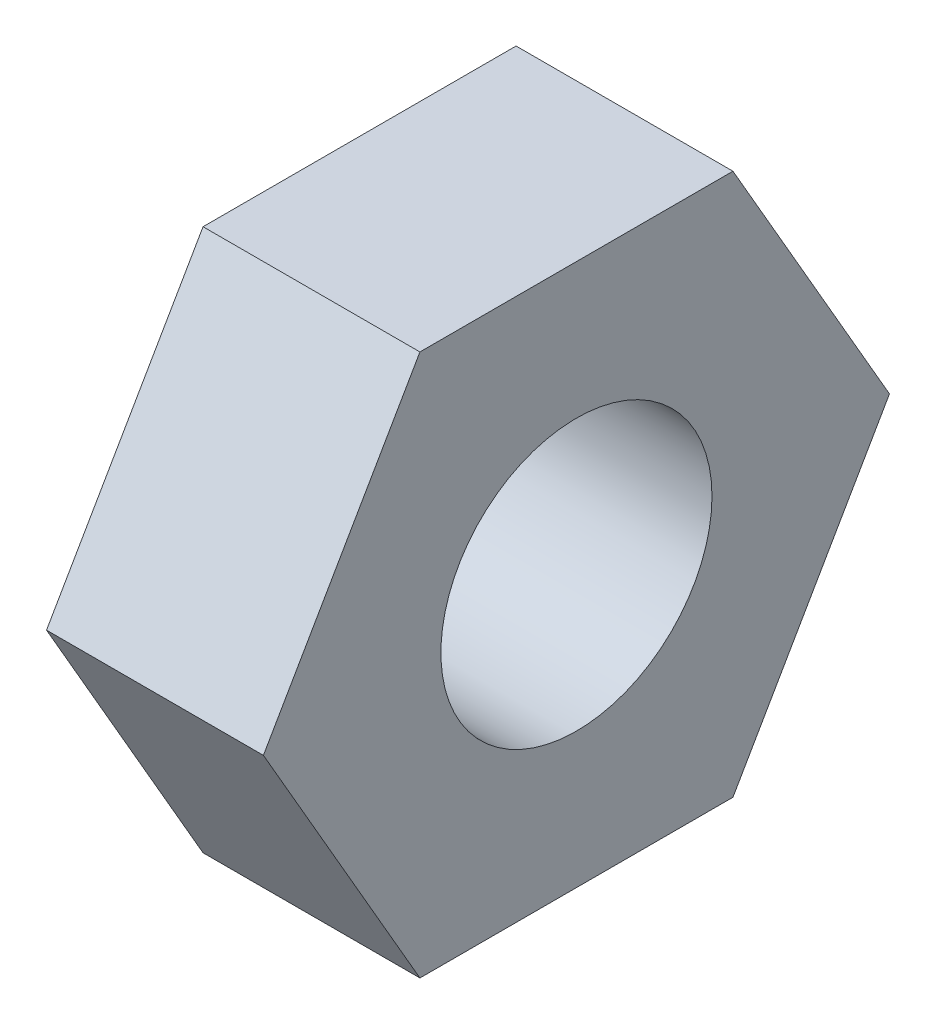
ISO-10303-21;
HEADER;
FILE_DESCRIPTION(('STEP AP214'),'2;1');
FILE_NAME('part.step','',(''),(''),'','','');
FILE_SCHEMA(('AUTOMOTIVE_DESIGN { 1 0 10303 214 1 1 1 1 }'));
ENDSEC;
DATA;
#1=APPLICATION_CONTEXT('core data for automotive mechanical design processes');
#2=APPLICATION_PROTOCOL_DEFINITION('international standard','automotive_design',2000,#1);
#3=PRODUCT_CONTEXT('',#1,'mechanical');
#4=PRODUCT('Part','Part','',(#3));
#5=PRODUCT_RELATED_PRODUCT_CATEGORY('part','',(#4));
#6=PRODUCT_DEFINITION_FORMATION('','',#4);
#7=PRODUCT_DEFINITION_CONTEXT('part definition',#1,'design');
#8=PRODUCT_DEFINITION('design','',#6,#7);
#9=PRODUCT_DEFINITION_SHAPE('','',#8);
#10=(LENGTH_UNIT() NAMED_UNIT(*) SI_UNIT(.MILLI.,.METRE.));
#11=(NAMED_UNIT(*) PLANE_ANGLE_UNIT() SI_UNIT($,.RADIAN.));
#12=(NAMED_UNIT(*) SI_UNIT($,.STERADIAN.) SOLID_ANGLE_UNIT());
#13=UNCERTAINTY_MEASURE_WITH_UNIT(LENGTH_MEASURE(1.E-05),#10,'distance_accuracy_value','');
#14=(GEOMETRIC_REPRESENTATION_CONTEXT(3) GLOBAL_UNCERTAINTY_ASSIGNED_CONTEXT((#13)) GLOBAL_UNIT_ASSIGNED_CONTEXT((#10,
#11,#12)) REPRESENTATION_CONTEXT('',''));
#15=CARTESIAN_POINT('',(0.,0.,0.));
#16=DIRECTION('',(0.,0.,1.));
#17=DIRECTION('',(1.,0.,0.));
#18=AXIS2_PLACEMENT_3D('',#15,#16,#17);
#19=CARTESIAN_POINT('',(2.,-2.5,-1.44337567297406));
#20=DIRECTION('',(0.,0.5,0.866025403784439));
#21=DIRECTION('',(0.,-0.866025403784439,0.5));
#22=AXIS2_PLACEMENT_3D('',#19,#20,#21);
#23=PLANE('',#22);
#24=DIRECTION('',(0.,0.866025403784439,-0.5));
#25=VECTOR('',#24,1.);
#26=CARTESIAN_POINT('',(0.,-2.5,-1.44337567297406));
#27=LINE('',#26,#25);
#28=CARTESIAN_POINT('',(0.,-2.5,-1.44337567297406));
#29=VERTEX_POINT('',#28);
#30=CARTESIAN_POINT('',(0.,0.,-2.88675134594813));
#31=VERTEX_POINT('',#30);
#32=EDGE_CURVE('E127',#29,#31,#27,.T.);
#33=ORIENTED_EDGE('',*,*,#32,.T.);
#34=DIRECTION('',(-1.,0.,0.));
#35=VECTOR('',#34,1.);
#36=CARTESIAN_POINT('',(2.,0.,-2.88675134594813));
#37=LINE('',#36,#35);
#38=CARTESIAN_POINT('',(2.,0.,-2.88675134594813));
#39=VERTEX_POINT('',#38);
#40=EDGE_CURVE('E11',#39,#31,#37,.T.);
#41=ORIENTED_EDGE('',*,*,#40,.F.);
#42=DIRECTION('',(0.,0.866025403784439,-0.5));
#43=VECTOR('',#42,1.);
#44=CARTESIAN_POINT('',(2.,-2.5,-1.44337567297406));
#45=LINE('',#44,#43);
#46=CARTESIAN_POINT('',(2.,-2.5,-1.44337567297406));
#47=VERTEX_POINT('',#46);
#48=EDGE_CURVE('E139',#47,#39,#45,.T.);
#49=ORIENTED_EDGE('',*,*,#48,.F.);
#50=DIRECTION('',(-1.,0.,0.));
#51=VECTOR('',#50,1.);
#52=CARTESIAN_POINT('',(2.,-2.5,-1.44337567297406));
#53=LINE('',#52,#51);
#54=EDGE_CURVE('E124',#47,#29,#53,.T.);
#55=ORIENTED_EDGE('',*,*,#54,.T.);
#56=EDGE_LOOP('',(#33,#41,#49,#55));
#57=FACE_BOUND('',#56,.T.);
#58=ADVANCED_FACE('F41',(#57),#23,.F.);
#59=CARTESIAN_POINT('',(2.,0.,-2.88675134594813));
#60=DIRECTION('',(0.,-0.5,0.866025403784439));
#61=DIRECTION('',(0.,-0.866025403784439,-0.5));
#62=AXIS2_PLACEMENT_3D('',#59,#60,#61);
#63=PLANE('',#62);
#64=DIRECTION('',(0.,0.866025403784439,0.5));
#65=VECTOR('',#64,1.);
#66=CARTESIAN_POINT('',(0.,0.,-2.88675134594813));
#67=LINE('',#66,#65);
#68=CARTESIAN_POINT('',(0.,2.5,-1.44337567297406));
#69=VERTEX_POINT('',#68);
#70=EDGE_CURVE('E129',#31,#69,#67,.T.);
#71=ORIENTED_EDGE('',*,*,#70,.T.);
#72=DIRECTION('',(-1.,0.,0.));
#73=VECTOR('',#72,1.);
#74=CARTESIAN_POINT('',(2.,2.5,-1.44337567297406));
#75=LINE('',#74,#73);
#76=CARTESIAN_POINT('',(2.,2.5,-1.44337567297406));
#77=VERTEX_POINT('',#76);
#78=EDGE_CURVE('E49',#77,#69,#75,.T.);
#79=ORIENTED_EDGE('',*,*,#78,.F.);
#80=DIRECTION('',(0.,0.866025403784439,0.5));
#81=VECTOR('',#80,1.);
#82=CARTESIAN_POINT('',(2.,0.,-2.88675134594813));
#83=LINE('',#82,#81);
#84=EDGE_CURVE('E92',#39,#77,#83,.T.);
#85=ORIENTED_EDGE('',*,*,#84,.F.);
#86=ORIENTED_EDGE('',*,*,#40,.T.);
#87=EDGE_LOOP('',(#71,#79,#85,#86));
#88=FACE_BOUND('',#87,.T.);
#89=ADVANCED_FACE('F162',(#88),#63,.F.);
#90=CARTESIAN_POINT('',(2.,2.5,-1.44337567297406));
#91=DIRECTION('',(0.,-1.,0.));
#92=DIRECTION('',(0.,0.,-1.));
#93=AXIS2_PLACEMENT_3D('',#90,#91,#92);
#94=PLANE('',#93);
#95=DIRECTION('',(0.,0.,1.));
#96=VECTOR('',#95,1.);
#97=CARTESIAN_POINT('',(0.,2.5,-1.44337567297406));
#98=LINE('',#97,#96);
#99=CARTESIAN_POINT('',(0.,2.5,1.44337567297406));
#100=VERTEX_POINT('',#99);
#101=EDGE_CURVE('E131',#69,#100,#98,.T.);
#102=ORIENTED_EDGE('',*,*,#101,.T.);
#103=DIRECTION('',(-1.,0.,0.));
#104=VECTOR('',#103,1.);
#105=CARTESIAN_POINT('',(2.,2.5,1.44337567297406));
#106=LINE('',#105,#104);
#107=CARTESIAN_POINT('',(2.,2.5,1.44337567297406));
#108=VERTEX_POINT('',#107);
#109=EDGE_CURVE('E116',#108,#100,#106,.T.);
#110=ORIENTED_EDGE('',*,*,#109,.F.);
#111=DIRECTION('',(0.,0.,1.));
#112=VECTOR('',#111,1.);
#113=CARTESIAN_POINT('',(2.,2.5,-1.44337567297406));
#114=LINE('',#113,#112);
#115=EDGE_CURVE('E107',#77,#108,#114,.T.);
#116=ORIENTED_EDGE('',*,*,#115,.F.);
#117=ORIENTED_EDGE('',*,*,#78,.T.);
#118=EDGE_LOOP('',(#102,#110,#116,#117));
#119=FACE_BOUND('',#118,.T.);
#120=ADVANCED_FACE('F145',(#119),#94,.F.);
#121=CARTESIAN_POINT('',(2.,2.5,1.44337567297406));
#122=DIRECTION('',(0.,-0.5,-0.866025403784439));
#123=DIRECTION('',(0.,0.866025403784439,-0.5));
#124=AXIS2_PLACEMENT_3D('',#121,#122,#123);
#125=PLANE('',#124);
#126=DIRECTION('',(0.,-0.866025403784439,0.5));
#127=VECTOR('',#126,1.);
#128=CARTESIAN_POINT('',(0.,2.5,1.44337567297406));
#129=LINE('',#128,#127);
#130=CARTESIAN_POINT('',(0.,0.,2.88675134594813));
#131=VERTEX_POINT('',#130);
#132=EDGE_CURVE('E119',#100,#131,#129,.T.);
#133=ORIENTED_EDGE('',*,*,#132,.T.);
#134=DIRECTION('',(-1.,0.,0.));
#135=VECTOR('',#134,1.);
#136=CARTESIAN_POINT('',(2.,0.,2.88675134594813));
#137=LINE('',#136,#135);
#138=CARTESIAN_POINT('',(2.,0.,2.88675134594813));
#139=VERTEX_POINT('',#138);
#140=EDGE_CURVE('E114',#139,#131,#137,.T.);
#141=ORIENTED_EDGE('',*,*,#140,.F.);
#142=DIRECTION('',(0.,-0.866025403784439,0.5));
#143=VECTOR('',#142,1.);
#144=CARTESIAN_POINT('',(2.,2.5,1.44337567297406));
#145=LINE('',#144,#143);
#146=EDGE_CURVE('E105',#108,#139,#145,.T.);
#147=ORIENTED_EDGE('',*,*,#146,.F.);
#148=ORIENTED_EDGE('',*,*,#109,.T.);
#149=EDGE_LOOP('',(#133,#141,#147,#148));
#150=FACE_BOUND('',#149,.T.);
#151=ADVANCED_FACE('F111',(#150),#125,.F.);
#152=CARTESIAN_POINT('',(2.,0.,2.88675134594813));
#153=DIRECTION('',(0.,0.5,-0.866025403784439));
#154=DIRECTION('',(0.,0.866025403784439,0.5));
#155=AXIS2_PLACEMENT_3D('',#152,#153,#154);
#156=PLANE('',#155);
#157=DIRECTION('',(0.,-0.866025403784439,-0.5));
#158=VECTOR('',#157,1.);
#159=CARTESIAN_POINT('',(0.,0.,2.88675134594813));
#160=LINE('',#159,#158);
#161=CARTESIAN_POINT('',(0.,-2.5,1.44337567297407));
#162=VERTEX_POINT('',#161);
#163=EDGE_CURVE('E83',#131,#162,#160,.T.);
#164=ORIENTED_EDGE('',*,*,#163,.T.);
#165=DIRECTION('',(-1.,0.,0.));
#166=VECTOR('',#165,1.);
#167=CARTESIAN_POINT('',(2.,-2.5,1.44337567297407));
#168=LINE('',#167,#166);
#169=CARTESIAN_POINT('',(2.,-2.5,1.44337567297407));
#170=VERTEX_POINT('',#169);
#171=EDGE_CURVE('E120',#170,#162,#168,.T.);
#172=ORIENTED_EDGE('',*,*,#171,.F.);
#173=DIRECTION('',(0.,-0.866025403784439,-0.5));
#174=VECTOR('',#173,1.);
#175=CARTESIAN_POINT('',(2.,0.,2.88675134594813));
#176=LINE('',#175,#174);
#177=EDGE_CURVE('E106',#139,#170,#176,.T.);
#178=ORIENTED_EDGE('',*,*,#177,.F.);
#179=ORIENTED_EDGE('',*,*,#140,.T.);
#180=EDGE_LOOP('',(#164,#172,#178,#179));
#181=FACE_BOUND('',#180,.T.);
#182=ADVANCED_FACE('F117',(#181),#156,.F.);
#183=CARTESIAN_POINT('',(2.,-2.5,1.44337567297407));
#184=DIRECTION('',(0.,1.,0.));
#185=DIRECTION('',(0.,0.,1.));
#186=AXIS2_PLACEMENT_3D('',#183,#184,#185);
#187=PLANE('',#186);
#188=DIRECTION('',(0.,0.,-1.));
#189=VECTOR('',#188,1.);
#190=CARTESIAN_POINT('',(0.,-2.5,1.44337567297407));
#191=LINE('',#190,#189);
#192=EDGE_CURVE('E87',#162,#29,#191,.T.);
#193=ORIENTED_EDGE('',*,*,#192,.T.);
#194=ORIENTED_EDGE('',*,*,#54,.F.);
#195=DIRECTION('',(0.,0.,-1.));
#196=VECTOR('',#195,1.);
#197=CARTESIAN_POINT('',(2.,-2.5,1.44337567297407));
#198=LINE('',#197,#196);
#199=EDGE_CURVE('E59',#170,#47,#198,.T.);
#200=ORIENTED_EDGE('',*,*,#199,.F.);
#201=ORIENTED_EDGE('',*,*,#171,.T.);
#202=EDGE_LOOP('',(#193,#194,#200,#201));
#203=FACE_BOUND('',#202,.T.);
#204=ADVANCED_FACE('F151',(#203),#187,.F.);
#205=CARTESIAN_POINT('',(2.,0.,0.));
#206=DIRECTION('',(1.,0.,0.));
#207=DIRECTION('',(0.,0.,-1.));
#208=AXIS2_PLACEMENT_3D('',#205,#206,#207);
#209=PLANE('',#208);
#210=CARTESIAN_POINT('',(2.,0.,0.));
#211=DIRECTION('',(1.,0.,0.));
#212=DIRECTION('',(0.,0.,-1.));
#213=AXIS2_PLACEMENT_3D('',#210,#211,#212);
#214=CIRCLE('',#213,1.25);
#215=CARTESIAN_POINT('',(2.,0.,-1.25));
#216=VERTEX_POINT('',#215);
#217=EDGE_CURVE('E128',#216,#216,#214,.F.);
#218=ORIENTED_EDGE('',*,*,#217,.T.);
#219=EDGE_LOOP('',(#218));
#220=FACE_BOUND('',#219,.T.);
#221=ORIENTED_EDGE('',*,*,#48,.T.);
#222=ORIENTED_EDGE('',*,*,#84,.T.);
#223=ORIENTED_EDGE('',*,*,#115,.T.);
#224=ORIENTED_EDGE('',*,*,#146,.T.);
#225=ORIENTED_EDGE('',*,*,#177,.T.);
#226=ORIENTED_EDGE('',*,*,#199,.T.);
#227=EDGE_LOOP('',(#221,#222,#223,#224,#225,#226));
#228=FACE_BOUND('',#227,.T.);
#229=ADVANCED_FACE('F102',(#220,#228),#209,.T.);
#230=CARTESIAN_POINT('',(0.,0.,0.));
#231=DIRECTION('',(1.,0.,0.));
#232=DIRECTION('',(0.,0.,-1.));
#233=AXIS2_PLACEMENT_3D('',#230,#231,#232);
#234=PLANE('',#233);
#235=CARTESIAN_POINT('',(0.,0.,0.));
#236=DIRECTION('',(1.,0.,0.));
#237=DIRECTION('',(0.,0.,-1.));
#238=AXIS2_PLACEMENT_3D('',#235,#236,#237);
#239=CIRCLE('',#238,1.25);
#240=CARTESIAN_POINT('',(0.,0.,-1.25));
#241=VERTEX_POINT('',#240);
#242=EDGE_CURVE('E42',#241,#241,#239,.F.);
#243=ORIENTED_EDGE('',*,*,#242,.F.);
#244=EDGE_LOOP('',(#243));
#245=FACE_BOUND('',#244,.T.);
#246=ORIENTED_EDGE('',*,*,#32,.F.);
#247=ORIENTED_EDGE('',*,*,#192,.F.);
#248=ORIENTED_EDGE('',*,*,#163,.F.);
#249=ORIENTED_EDGE('',*,*,#132,.F.);
#250=ORIENTED_EDGE('',*,*,#101,.F.);
#251=ORIENTED_EDGE('',*,*,#70,.F.);
#252=EDGE_LOOP('',(#246,#247,#248,#249,#250,#251));
#253=FACE_BOUND('',#252,.T.);
#254=ADVANCED_FACE('F150',(#245,#253),#234,.F.);
#255=CARTESIAN_POINT('',(-400.,0.,0.));
#256=DIRECTION('',(-1.,0.,0.));
#257=DIRECTION('',(0.,0.,1.));
#258=AXIS2_PLACEMENT_3D('',#255,#256,#257);
#259=CYLINDRICAL_SURFACE('',#258,1.25);
#260=ORIENTED_EDGE('',*,*,#217,.F.);
#261=EDGE_LOOP('',(#260));
#262=FACE_BOUND('',#261,.T.);
#263=ORIENTED_EDGE('',*,*,#242,.T.);
#264=EDGE_LOOP('',(#263));
#265=FACE_BOUND('',#264,.T.);
#266=ADVANCED_FACE('F205',(#262,#265),#259,.F.);
#267=CLOSED_SHELL('',(#58,#89,#120,#151,#182,#204,#229,#254,#266));
#268=MANIFOLD_SOLID_BREP('B2',#267);
#269=ADVANCED_BREP_SHAPE_REPRESENTATION('',(#18,#268),#14);
#270=SHAPE_DEFINITION_REPRESENTATION(#9,#269);
ENDSEC;
END-ISO-10303-21;
